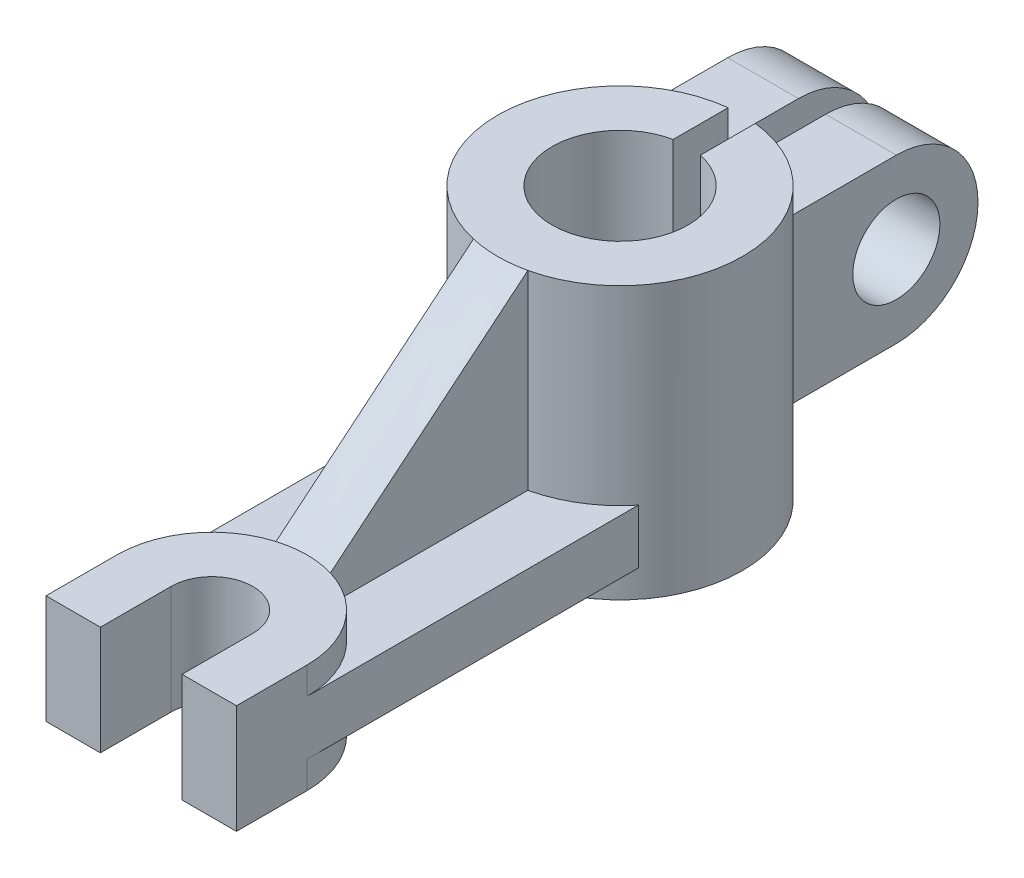
ISO-10303-21;
HEADER;
FILE_DESCRIPTION(('STEP AP214'),'2;1');
FILE_NAME('part.step','',(''),(''),'','','');
FILE_SCHEMA(('AUTOMOTIVE_DESIGN { 1 0 10303 214 1 1 1 1 }'));
ENDSEC;
DATA;
#1=APPLICATION_CONTEXT('core data for automotive mechanical design processes');
#2=APPLICATION_PROTOCOL_DEFINITION('international standard','automotive_design',2000,#1);
#3=PRODUCT_CONTEXT('',#1,'mechanical');
#4=PRODUCT('Part','Part','',(#3));
#5=PRODUCT_RELATED_PRODUCT_CATEGORY('part','',(#4));
#6=PRODUCT_DEFINITION_FORMATION('','',#4);
#7=PRODUCT_DEFINITION_CONTEXT('part definition',#1,'design');
#8=PRODUCT_DEFINITION('design','',#6,#7);
#9=PRODUCT_DEFINITION_SHAPE('','',#8);
#10=(LENGTH_UNIT() NAMED_UNIT(*) SI_UNIT(.MILLI.,.METRE.));
#11=(NAMED_UNIT(*) PLANE_ANGLE_UNIT() SI_UNIT($,.RADIAN.));
#12=(NAMED_UNIT(*) SI_UNIT($,.STERADIAN.) SOLID_ANGLE_UNIT());
#13=UNCERTAINTY_MEASURE_WITH_UNIT(LENGTH_MEASURE(1.E-05),#10,'distance_accuracy_value','');
#14=(GEOMETRIC_REPRESENTATION_CONTEXT(3) GLOBAL_UNCERTAINTY_ASSIGNED_CONTEXT((#13)) GLOBAL_UNIT_ASSIGNED_CONTEXT((#10,
#11,#12)) REPRESENTATION_CONTEXT('',''));
#15=CARTESIAN_POINT('',(0.,0.,0.));
#16=DIRECTION('',(0.,0.,1.));
#17=DIRECTION('',(1.,0.,0.));
#18=AXIS2_PLACEMENT_3D('',#15,#16,#17);
#19=CARTESIAN_POINT('',(0.,45.,-88.));
#20=DIRECTION('',(0.,-1.,0.));
#21=DIRECTION('',(0.,0.,-1.));
#22=AXIS2_PLACEMENT_3D('',#19,#20,#21);
#23=CYLINDRICAL_SURFACE('',#22,22.5);
#24=DIRECTION('',(0.,-1.,0.));
#25=VECTOR('',#24,1.);
#26=CARTESIAN_POINT('',(2.5,45.,-110.360679774998));
#27=LINE('',#26,#25);
#28=CARTESIAN_POINT('',(2.5,45.,-110.360679774998));
#29=VERTEX_POINT('',#28);
#30=CARTESIAN_POINT('',(2.5,40.,-110.360679774998));
#31=VERTEX_POINT('',#30);
#32=EDGE_CURVE('E422',#29,#31,#27,.T.);
#33=ORIENTED_EDGE('',*,*,#32,.F.);
#34=CARTESIAN_POINT('',(0.,45.,-88.));
#35=DIRECTION('',(0.,1.,0.));
#36=DIRECTION('',(0.,0.,1.));
#37=AXIS2_PLACEMENT_3D('',#34,#35,#36);
#38=CIRCLE('',#37,22.5);
#39=CARTESIAN_POINT('',(5.,45.,-66.0625890315197));
#40=VERTEX_POINT('',#39);
#41=EDGE_CURVE('E296',#40,#29,#38,.T.);
#42=ORIENTED_EDGE('',*,*,#41,.F.);
#43=DIRECTION('',(0.,1.,0.));
#44=VECTOR('',#43,1.);
#45=CARTESIAN_POINT('',(5.,45.,-66.0625890315197));
#46=LINE('',#45,#44);
#47=CARTESIAN_POINT('',(5.,10.,-66.0625890315197));
#48=VERTEX_POINT('',#47);
#49=EDGE_CURVE('E321',#48,#40,#46,.T.);
#50=ORIENTED_EDGE('',*,*,#49,.F.);
#51=CARTESIAN_POINT('',(0.,10.,-88.));
#52=DIRECTION('',(0.,1.,0.));
#53=DIRECTION('',(0.,0.,1.));
#54=AXIS2_PLACEMENT_3D('',#51,#52,#53);
#55=CIRCLE('',#54,22.5);
#56=CARTESIAN_POINT('',(17.5,10.,-73.857864376269));
#57=VERTEX_POINT('',#56);
#58=EDGE_CURVE('E289',#48,#57,#55,.T.);
#59=ORIENTED_EDGE('',*,*,#58,.T.);
#60=DIRECTION('',(0.,-1.,0.));
#61=VECTOR('',#60,1.);
#62=CARTESIAN_POINT('',(17.5,10.,-73.857864376269));
#63=LINE('',#62,#61);
#64=CARTESIAN_POINT('',(17.5,0.,-73.857864376269));
#65=VERTEX_POINT('',#64);
#66=EDGE_CURVE('E651',#57,#65,#63,.T.);
#67=ORIENTED_EDGE('',*,*,#66,.T.);
#68=CARTESIAN_POINT('',(0.,0.,-88.));
#69=DIRECTION('',(0.,1.,0.));
#70=DIRECTION('',(0.,0.,1.));
#71=AXIS2_PLACEMENT_3D('',#68,#69,#70);
#72=CIRCLE('',#71,22.5);
#73=CARTESIAN_POINT('',(-17.5,0.,-73.857864376269));
#74=VERTEX_POINT('',#73);
#75=EDGE_CURVE('E300',#74,#65,#72,.T.);
#76=ORIENTED_EDGE('',*,*,#75,.F.);
#77=DIRECTION('',(0.,-1.,0.));
#78=VECTOR('',#77,1.);
#79=CARTESIAN_POINT('',(-17.5,10.,-73.857864376269));
#80=LINE('',#79,#78);
#81=CARTESIAN_POINT('',(-17.5,10.,-73.857864376269));
#82=VERTEX_POINT('',#81);
#83=EDGE_CURVE('E669',#82,#74,#80,.T.);
#84=ORIENTED_EDGE('',*,*,#83,.F.);
#85=CARTESIAN_POINT('',(-5.,10.,-66.0625890315197));
#86=VERTEX_POINT('',#85);
#87=EDGE_CURVE('E292',#82,#86,#55,.T.);
#88=ORIENTED_EDGE('',*,*,#87,.T.);
#89=DIRECTION('',(0.,1.,0.));
#90=VECTOR('',#89,1.);
#91=CARTESIAN_POINT('',(-5.,45.,-66.0625890315197));
#92=LINE('',#91,#90);
#93=CARTESIAN_POINT('',(-5.,45.,-66.0625890315197));
#94=VERTEX_POINT('',#93);
#95=EDGE_CURVE('E342',#86,#94,#92,.T.);
#96=ORIENTED_EDGE('',*,*,#95,.T.);
#97=CARTESIAN_POINT('',(-2.5,45.,-110.360679774998));
#98=VERTEX_POINT('',#97);
#99=EDGE_CURVE('E277',#98,#94,#38,.T.);
#100=ORIENTED_EDGE('',*,*,#99,.F.);
#101=DIRECTION('',(0.,-1.,0.));
#102=VECTOR('',#101,1.);
#103=CARTESIAN_POINT('',(-2.5,45.,-110.360679774998));
#104=LINE('',#103,#102);
#105=CARTESIAN_POINT('',(-2.49999999999999,40.,-110.360679774998));
#106=VERTEX_POINT('',#105);
#107=EDGE_CURVE('E266',#106,#98,#104,.F.);
#108=ORIENTED_EDGE('',*,*,#107,.F.);
#109=CARTESIAN_POINT('',(0.,40.,-88.));
#110=DIRECTION('',(0.,-1.,0.));
#111=DIRECTION('',(0.,0.,-1.));
#112=AXIS2_PLACEMENT_3D('',#109,#110,#111);
#113=CIRCLE('',#112,22.5);
#114=CARTESIAN_POINT('',(-15.5,40.,-104.3095064303));
#115=VERTEX_POINT('',#114);
#116=EDGE_CURVE('E12',#115,#106,#113,.T.);
#117=ORIENTED_EDGE('',*,*,#116,.F.);
#118=DIRECTION('',(0.,-1.,0.));
#119=VECTOR('',#118,1.);
#120=CARTESIAN_POINT('',(-15.5,45.,-104.3095064303));
#121=LINE('',#120,#119);
#122=CARTESIAN_POINT('',(-15.5,10.,-104.3095064303));
#123=VERTEX_POINT('',#122);
#124=EDGE_CURVE('E384',#123,#115,#121,.F.);
#125=ORIENTED_EDGE('',*,*,#124,.F.);
#126=CARTESIAN_POINT('',(0.,10.,-88.));
#127=DIRECTION('',(0.,1.,0.));
#128=DIRECTION('',(0.,0.,1.));
#129=AXIS2_PLACEMENT_3D('',#126,#127,#128);
#130=CIRCLE('',#129,22.5);
#131=CARTESIAN_POINT('',(-2.5,10.,-110.360679774998));
#132=VERTEX_POINT('',#131);
#133=EDGE_CURVE('E261',#132,#123,#130,.T.);
#134=ORIENTED_EDGE('',*,*,#133,.F.);
#135=CARTESIAN_POINT('',(-2.5,-5.,-110.360679774998));
#136=VERTEX_POINT('',#135);
#137=EDGE_CURVE('E76',#136,#132,#104,.F.);
#138=ORIENTED_EDGE('',*,*,#137,.F.);
#139=CARTESIAN_POINT('',(0.,-5.,-88.));
#140=DIRECTION('',(0.,1.,0.));
#141=DIRECTION('',(0.,0.,1.));
#142=AXIS2_PLACEMENT_3D('',#139,#140,#141);
#143=CIRCLE('',#142,22.5);
#144=CARTESIAN_POINT('',(2.5,-5.,-110.360679774998));
#145=VERTEX_POINT('',#144);
#146=EDGE_CURVE('E259',#136,#145,#143,.T.);
#147=ORIENTED_EDGE('',*,*,#146,.T.);
#148=CARTESIAN_POINT('',(2.5,10.,-110.360679774998));
#149=VERTEX_POINT('',#148);
#150=EDGE_CURVE('E418',#149,#145,#27,.T.);
#151=ORIENTED_EDGE('',*,*,#150,.F.);
#152=CARTESIAN_POINT('',(15.5,10.,-104.3095064303));
#153=VERTEX_POINT('',#152);
#154=EDGE_CURVE('E380',#153,#149,#130,.T.);
#155=ORIENTED_EDGE('',*,*,#154,.F.);
#156=DIRECTION('',(0.,-1.,0.));
#157=VECTOR('',#156,1.);
#158=CARTESIAN_POINT('',(15.5,45.,-104.3095064303));
#159=LINE('',#158,#157);
#160=CARTESIAN_POINT('',(15.5,40.,-104.3095064303));
#161=VERTEX_POINT('',#160);
#162=EDGE_CURVE('E388',#153,#161,#159,.F.);
#163=ORIENTED_EDGE('',*,*,#162,.T.);
#164=EDGE_CURVE('E60',#31,#161,#113,.T.);
#165=ORIENTED_EDGE('',*,*,#164,.F.);
#166=EDGE_LOOP('',(#33,#42,#50,#59,#67,#76,#84,#88,#96,#100,#108,#117,#125,#134,#138,#147,#151,
#155,#163,#165));
#167=FACE_BOUND('',#166,.T.);
#168=ADVANCED_FACE('F50',(#167),#23,.T.);
#169=CARTESIAN_POINT('',(0.,45.,-88.));
#170=DIRECTION('',(0.,-1.,0.));
#171=DIRECTION('',(0.,0.,-1.));
#172=AXIS2_PLACEMENT_3D('',#169,#170,#171);
#173=CYLINDRICAL_SURFACE('',#172,12.5);
#174=CARTESIAN_POINT('',(0.,45.,-88.));
#175=DIRECTION('',(0.,1.,0.));
#176=DIRECTION('',(0.,0.,1.));
#177=AXIS2_PLACEMENT_3D('',#174,#175,#176);
#178=CIRCLE('',#177,12.5);
#179=CARTESIAN_POINT('',(-2.49999999999999,45.,-100.247448713916));
#180=VERTEX_POINT('',#179);
#181=CARTESIAN_POINT('',(2.49999999999999,45.,-100.247448713916));
#182=VERTEX_POINT('',#181);
#183=EDGE_CURVE('E270',#180,#182,#178,.T.);
#184=ORIENTED_EDGE('',*,*,#183,.T.);
#185=DIRECTION('',(0.,-1.,0.));
#186=VECTOR('',#185,1.);
#187=CARTESIAN_POINT('',(2.49999999999999,45.,-100.247448713916));
#188=LINE('',#187,#186);
#189=CARTESIAN_POINT('',(2.49999999999999,-5.,-100.247448713916));
#190=VERTEX_POINT('',#189);
#191=EDGE_CURVE('E429',#182,#190,#188,.T.);
#192=ORIENTED_EDGE('',*,*,#191,.T.);
#193=CARTESIAN_POINT('',(0.,-5.,-88.));
#194=DIRECTION('',(0.,1.,0.));
#195=DIRECTION('',(0.,0.,1.));
#196=AXIS2_PLACEMENT_3D('',#193,#194,#195);
#197=CIRCLE('',#196,12.5);
#198=CARTESIAN_POINT('',(-2.49999999999999,-5.,-100.247448713916));
#199=VERTEX_POINT('',#198);
#200=EDGE_CURVE('E271',#199,#190,#197,.T.);
#201=ORIENTED_EDGE('',*,*,#200,.F.);
#202=DIRECTION('',(0.,-1.,0.));
#203=VECTOR('',#202,1.);
#204=CARTESIAN_POINT('',(-2.49999999999999,45.,-100.247448713916));
#205=LINE('',#204,#203);
#206=EDGE_CURVE('E245',#199,#180,#205,.F.);
#207=ORIENTED_EDGE('',*,*,#206,.T.);
#208=EDGE_LOOP('',(#184,#192,#201,#207));
#209=FACE_BOUND('',#208,.T.);
#210=ADVANCED_FACE('F562',(#209),#173,.F.);
#211=CARTESIAN_POINT('',(0.,45.,0.));
#212=DIRECTION('',(0.,1.,0.));
#213=DIRECTION('',(0.,0.,1.));
#214=AXIS2_PLACEMENT_3D('',#211,#212,#213);
#215=PLANE('',#214);
#216=ORIENTED_EDGE('',*,*,#41,.T.);
#217=DIRECTION('',(0.,0.,1.));
#218=VECTOR('',#217,1.);
#219=CARTESIAN_POINT('',(2.49999999999998,45.,0.));
#220=LINE('',#219,#218);
#221=EDGE_CURVE('E425',#29,#182,#220,.T.);
#222=ORIENTED_EDGE('',*,*,#221,.T.);
#223=ORIENTED_EDGE('',*,*,#183,.F.);
#224=DIRECTION('',(0.,0.,-1.));
#225=VECTOR('',#224,1.);
#226=CARTESIAN_POINT('',(-2.49999999999998,45.,0.));
#227=LINE('',#226,#225);
#228=EDGE_CURVE('E407',#180,#98,#227,.T.);
#229=ORIENTED_EDGE('',*,*,#228,.T.);
#230=ORIENTED_EDGE('',*,*,#99,.T.);
#231=CARTESIAN_POINT('',(1.66533453693773E-11,45.,-65.5));
#232=CARTESIAN_POINT('',(-0.127966613440222,44.9999921242405,-65.4999901295293));
#233=CARTESIAN_POINT('',(-0.255934435168659,44.9999663740976,-65.5010661592238));
#234=CARTESIAN_POINT('',(-0.566358750829926,44.9998756278307,-65.5063241894873));
#235=CARTESIAN_POINT('',(-0.748796834333823,44.9997985835739,-65.5116343608658));
#236=CARTESIAN_POINT('',(-1.16821464852716,44.9996083607107,-65.5289886310783));
#237=CARTESIAN_POINT('',(-1.40513130463676,44.9994912769114,-65.5425753892245));
#238=CARTESIAN_POINT('',(-1.93360211912668,44.9991997534531,-65.5812821878649));
#239=CARTESIAN_POINT('',(-2.2250153330263,44.9990183057681,-65.6083527580827));
#240=CARTESIAN_POINT('',(-2.76896867202678,44.9987287580629,-65.6695967794294));
#241=CARTESIAN_POINT('',(-3.02166426223618,44.9986142085641,-65.7023996988718));
#242=CARTESIAN_POINT('',(-3.49648102010595,44.9985426443906,-65.7722672135756));
#243=CARTESIAN_POINT('',(-3.71874058631574,44.9985688599836,-65.8083926943038));
#244=CARTESIAN_POINT('',(-4.13268477732359,44.9987574648783,-65.8820219700267));
#245=CARTESIAN_POINT('',(-4.32451525343845,44.9989013343371,-65.9187076413366));
#246=CARTESIAN_POINT('',(-4.67760204405273,44.9993500184099,-65.99100455899));
#247=CARTESIAN_POINT('',(-4.83900390200514,44.9996265390741,-66.0259064213896));
#248=CARTESIAN_POINT('',(-5.,45.,-66.0625890315197));
#249=B_SPLINE_CURVE_WITH_KNOTS('',3,(#231,#232,#233,#234,#235,#236,#237,#238,#239,#240,#241,
#242,#243,#244,#245,#246,#247,#248),.UNSPECIFIED.,.F.,.F.,(4,2,2,2,2,2,2,2,4),(0.,
0.383898073149994,0.931389474268767,1.64318949280344,2.52096026779738,3.28526328273003,
3.96069074320102,4.54654582615478,5.04190420188116),.UNSPECIFIED.);
#250=CARTESIAN_POINT('',(0.,45.,-65.5));
#251=VERTEX_POINT('',#250);
#252=EDGE_CURVE('E537',#94,#251,#249,.F.);
#253=ORIENTED_EDGE('',*,*,#252,.T.);
#254=CARTESIAN_POINT('',(-5.,45.,-66.0625890315197));
#255=CARTESIAN_POINT('',(-3.33333333333333,45.,-65.6875296771732));
#256=CARTESIAN_POINT('',(0.,45.,-65.3124703228268));
#257=CARTESIAN_POINT('',(3.33333333333333,45.,-65.6875296771732));
#258=CARTESIAN_POINT('',(5.,45.,-66.0625890315197));
#259=B_SPLINE_CURVE_WITH_KNOTS('',3,(#254,#255,#256,#257,#258),.UNSPECIFIED.,.F.,.F.,(4,1,4),
(0.,0.5,1.),.UNSPECIFIED.);
#260=EDGE_CURVE('E332',#40,#251,#259,.F.);
#261=ORIENTED_EDGE('',*,*,#260,.F.);
#262=EDGE_LOOP('',(#216,#222,#223,#229,#230,#253,#261));
#263=FACE_BOUND('',#262,.T.);
#264=ADVANCED_FACE('F543',(#263),#215,.T.);
#265=CARTESIAN_POINT('',(0.,-5.,0.));
#266=DIRECTION('',(0.,1.,0.));
#267=DIRECTION('',(0.,0.,1.));
#268=AXIS2_PLACEMENT_3D('',#265,#266,#267);
#269=PLANE('',#268);
#270=DIRECTION('',(0.,0.,-1.));
#271=VECTOR('',#270,1.);
#272=CARTESIAN_POINT('',(2.49999999999999,-5.,-88.));
#273=LINE('',#272,#271);
#274=EDGE_CURVE('E252',#190,#145,#273,.T.);
#275=ORIENTED_EDGE('',*,*,#274,.T.);
#276=ORIENTED_EDGE('',*,*,#146,.F.);
#277=DIRECTION('',(0.,0.,1.));
#278=VECTOR('',#277,1.);
#279=CARTESIAN_POINT('',(-2.5,-5.,-143.720812674967));
#280=LINE('',#279,#278);
#281=EDGE_CURVE('E242',#136,#199,#280,.T.);
#282=ORIENTED_EDGE('',*,*,#281,.T.);
#283=ORIENTED_EDGE('',*,*,#200,.T.);
#284=EDGE_LOOP('',(#275,#276,#282,#283));
#285=FACE_BOUND('',#284,.T.);
#286=ADVANCED_FACE('F268',(#285),#269,.F.);
#287=CARTESIAN_POINT('',(15.5,25.,-123.28129451576));
#288=DIRECTION('',(-1.,0.,0.));
#289=DIRECTION('',(0.,0.,1.));
#290=AXIS2_PLACEMENT_3D('',#287,#288,#289);
#291=CYLINDRICAL_SURFACE('',#290,15.);
#292=CARTESIAN_POINT('',(2.5,25.,-123.28129451576));
#293=DIRECTION('',(-1.,0.,0.));
#294=DIRECTION('',(0.,0.,1.));
#295=AXIS2_PLACEMENT_3D('',#292,#293,#294);
#296=CIRCLE('',#295,15.);
#297=CARTESIAN_POINT('',(2.5,40.,-123.28129451576));
#298=VERTEX_POINT('',#297);
#299=CARTESIAN_POINT('',(2.5,10.,-123.28129451576));
#300=VERTEX_POINT('',#299);
#301=EDGE_CURVE('E68',#298,#300,#296,.T.);
#302=ORIENTED_EDGE('',*,*,#301,.F.);
#303=DIRECTION('',(-1.,0.,0.));
#304=VECTOR('',#303,1.);
#305=CARTESIAN_POINT('',(15.5,40.,-123.28129451576));
#306=LINE('',#305,#304);
#307=CARTESIAN_POINT('',(15.5,40.,-123.28129451576));
#308=VERTEX_POINT('',#307);
#309=EDGE_CURVE('E372',#308,#298,#306,.T.);
#310=ORIENTED_EDGE('',*,*,#309,.F.);
#311=CARTESIAN_POINT('',(15.5,25.,-123.28129451576));
#312=DIRECTION('',(1.,0.,0.));
#313=DIRECTION('',(0.,0.,-1.));
#314=AXIS2_PLACEMENT_3D('',#311,#312,#313);
#315=CIRCLE('',#314,15.);
#316=CARTESIAN_POINT('',(15.5,10.,-123.28129451576));
#317=VERTEX_POINT('',#316);
#318=EDGE_CURVE('E442',#317,#308,#315,.T.);
#319=ORIENTED_EDGE('',*,*,#318,.F.);
#320=DIRECTION('',(-1.,0.,0.));
#321=VECTOR('',#320,1.);
#322=CARTESIAN_POINT('',(15.5,10.,-123.28129451576));
#323=LINE('',#322,#321);
#324=EDGE_CURVE('E465',#317,#300,#323,.T.);
#325=ORIENTED_EDGE('',*,*,#324,.T.);
#326=EDGE_LOOP('',(#302,#310,#319,#325));
#327=FACE_BOUND('',#326,.T.);
#328=ADVANCED_FACE('F900',(#327),#291,.T.);
#329=CARTESIAN_POINT('',(-2.5,25.,-123.28129451576));
#330=DIRECTION('',(1.,0.,0.));
#331=DIRECTION('',(0.,0.,-1.));
#332=AXIS2_PLACEMENT_3D('',#329,#330,#331);
#333=CIRCLE('',#332,15.);
#334=CARTESIAN_POINT('',(-2.5,10.,-123.28129451576));
#335=VERTEX_POINT('',#334);
#336=CARTESIAN_POINT('',(-2.5,40.,-123.28129451576));
#337=VERTEX_POINT('',#336);
#338=EDGE_CURVE('E264',#335,#337,#333,.T.);
#339=ORIENTED_EDGE('',*,*,#338,.F.);
#340=CARTESIAN_POINT('',(-15.5,10.,-123.28129451576));
#341=VERTEX_POINT('',#340);
#342=EDGE_CURVE('E454',#335,#341,#323,.T.);
#343=ORIENTED_EDGE('',*,*,#342,.T.);
#344=CARTESIAN_POINT('',(-15.5,25.,-123.28129451576));
#345=DIRECTION('',(1.,0.,0.));
#346=DIRECTION('',(0.,0.,-1.));
#347=AXIS2_PLACEMENT_3D('',#344,#345,#346);
#348=CIRCLE('',#347,15.);
#349=CARTESIAN_POINT('',(-15.5,40.,-123.28129451576));
#350=VERTEX_POINT('',#349);
#351=EDGE_CURVE('E438',#341,#350,#348,.T.);
#352=ORIENTED_EDGE('',*,*,#351,.T.);
#353=EDGE_CURVE('E469',#337,#350,#306,.T.);
#354=ORIENTED_EDGE('',*,*,#353,.F.);
#355=EDGE_LOOP('',(#339,#343,#352,#354));
#356=FACE_BOUND('',#355,.T.);
#357=ADVANCED_FACE('F876',(#356),#291,.T.);
#358=CARTESIAN_POINT('',(15.5,40.,-123.28129451576));
#359=DIRECTION('',(0.,-1.,0.));
#360=DIRECTION('',(0.,0.,-1.));
#361=AXIS2_PLACEMENT_3D('',#358,#359,#360);
#362=PLANE('',#361);
#363=DIRECTION('',(0.,0.,-1.));
#364=VECTOR('',#363,1.);
#365=CARTESIAN_POINT('',(2.5,40.,-123.28129451576));
#366=LINE('',#365,#364);
#367=EDGE_CURVE('E421',#31,#298,#366,.T.);
#368=ORIENTED_EDGE('',*,*,#367,.F.);
#369=ORIENTED_EDGE('',*,*,#164,.T.);
#370=DIRECTION('',(0.,0.,1.));
#371=VECTOR('',#370,1.);
#372=CARTESIAN_POINT('',(15.5,40.,-123.28129451576));
#373=LINE('',#372,#371);
#374=EDGE_CURVE('E446',#308,#161,#373,.T.);
#375=ORIENTED_EDGE('',*,*,#374,.F.);
#376=ORIENTED_EDGE('',*,*,#309,.T.);
#377=EDGE_LOOP('',(#368,#369,#375,#376));
#378=FACE_BOUND('',#377,.T.);
#379=ADVANCED_FACE('F891',(#378),#362,.F.);
#380=DIRECTION('',(0.,0.,1.));
#381=VECTOR('',#380,1.);
#382=CARTESIAN_POINT('',(-2.5,40.,-123.28129451576));
#383=LINE('',#382,#381);
#384=EDGE_CURVE('E263',#337,#106,#383,.T.);
#385=ORIENTED_EDGE('',*,*,#384,.F.);
#386=ORIENTED_EDGE('',*,*,#353,.T.);
#387=DIRECTION('',(0.,0.,1.));
#388=VECTOR('',#387,1.);
#389=CARTESIAN_POINT('',(-15.5,40.,-123.28129451576));
#390=LINE('',#389,#388);
#391=EDGE_CURVE('E458',#350,#115,#390,.T.);
#392=ORIENTED_EDGE('',*,*,#391,.T.);
#393=ORIENTED_EDGE('',*,*,#116,.T.);
#394=EDGE_LOOP('',(#385,#386,#392,#393));
#395=FACE_BOUND('',#394,.T.);
#396=ADVANCED_FACE('F868',(#395),#362,.F.);
#397=CARTESIAN_POINT('',(15.5,10.,-101.412692913264));
#398=DIRECTION('',(0.,1.,0.));
#399=DIRECTION('',(0.,0.,1.));
#400=AXIS2_PLACEMENT_3D('',#397,#398,#399);
#401=PLANE('',#400);
#402=DIRECTION('',(0.,0.,1.));
#403=VECTOR('',#402,1.);
#404=CARTESIAN_POINT('',(2.5,10.,-101.412692913264));
#405=LINE('',#404,#403);
#406=EDGE_CURVE('E413',#300,#149,#405,.T.);
#407=ORIENTED_EDGE('',*,*,#406,.F.);
#408=ORIENTED_EDGE('',*,*,#324,.F.);
#409=DIRECTION('',(0.,0.,-1.));
#410=VECTOR('',#409,1.);
#411=CARTESIAN_POINT('',(15.5,10.,-101.412692913264));
#412=LINE('',#411,#410);
#413=EDGE_CURVE('E451',#153,#317,#412,.T.);
#414=ORIENTED_EDGE('',*,*,#413,.F.);
#415=ORIENTED_EDGE('',*,*,#154,.T.);
#416=EDGE_LOOP('',(#407,#408,#414,#415));
#417=FACE_BOUND('',#416,.T.);
#418=ADVANCED_FACE('F902',(#417),#401,.F.);
#419=DIRECTION('',(0.,0.,-1.));
#420=VECTOR('',#419,1.);
#421=CARTESIAN_POINT('',(-2.5,10.,-101.412692913264));
#422=LINE('',#421,#420);
#423=EDGE_CURVE('E393',#132,#335,#422,.T.);
#424=ORIENTED_EDGE('',*,*,#423,.F.);
#425=ORIENTED_EDGE('',*,*,#133,.T.);
#426=DIRECTION('',(0.,0.,-1.));
#427=VECTOR('',#426,1.);
#428=CARTESIAN_POINT('',(-15.5,10.,-101.412692913264));
#429=LINE('',#428,#427);
#430=EDGE_CURVE('E447',#123,#341,#429,.T.);
#431=ORIENTED_EDGE('',*,*,#430,.T.);
#432=ORIENTED_EDGE('',*,*,#342,.F.);
#433=EDGE_LOOP('',(#424,#425,#431,#432));
#434=FACE_BOUND('',#433,.T.);
#435=ADVANCED_FACE('F880',(#434),#401,.F.);
#436=CARTESIAN_POINT('',(15.5,25.,-123.28129451576));
#437=DIRECTION('',(-1.,0.,0.));
#438=DIRECTION('',(0.,0.,1.));
#439=AXIS2_PLACEMENT_3D('',#436,#437,#438);
#440=CYLINDRICAL_SURFACE('',#439,8.);
#441=CARTESIAN_POINT('',(15.5,25.,-123.28129451576));
#442=DIRECTION('',(1.,0.,0.));
#443=DIRECTION('',(0.,0.,-1.));
#444=AXIS2_PLACEMENT_3D('',#441,#442,#443);
#445=CIRCLE('',#444,8.);
#446=CARTESIAN_POINT('',(15.5,25.,-131.28129451576));
#447=VERTEX_POINT('',#446);
#448=EDGE_CURVE('E434',#447,#447,#445,.T.);
#449=ORIENTED_EDGE('',*,*,#448,.T.);
#450=EDGE_LOOP('',(#449));
#451=FACE_BOUND('',#450,.T.);
#452=CARTESIAN_POINT('',(2.5,25.,-123.28129451576));
#453=DIRECTION('',(-1.,0.,0.));
#454=DIRECTION('',(0.,0.,1.));
#455=AXIS2_PLACEMENT_3D('',#452,#453,#454);
#456=CIRCLE('',#455,8.);
#457=CARTESIAN_POINT('',(2.5,25.,-115.28129451576));
#458=VERTEX_POINT('',#457);
#459=EDGE_CURVE('E310',#458,#458,#456,.T.);
#460=ORIENTED_EDGE('',*,*,#459,.T.);
#461=EDGE_LOOP('',(#460));
#462=FACE_BOUND('',#461,.T.);
#463=ADVANCED_FACE('F912',(#451,#462),#440,.F.);
#464=CARTESIAN_POINT('',(-15.5,25.,-123.28129451576));
#465=DIRECTION('',(1.,0.,0.));
#466=DIRECTION('',(0.,0.,-1.));
#467=AXIS2_PLACEMENT_3D('',#464,#465,#466);
#468=CIRCLE('',#467,8.);
#469=CARTESIAN_POINT('',(-15.5,25.,-131.28129451576));
#470=VERTEX_POINT('',#469);
#471=EDGE_CURVE('E433',#470,#470,#468,.T.);
#472=ORIENTED_EDGE('',*,*,#471,.F.);
#473=EDGE_LOOP('',(#472));
#474=FACE_BOUND('',#473,.T.);
#475=CARTESIAN_POINT('',(-2.5,25.,-123.28129451576));
#476=DIRECTION('',(1.,0.,0.));
#477=DIRECTION('',(0.,0.,-1.));
#478=AXIS2_PLACEMENT_3D('',#475,#476,#477);
#479=CIRCLE('',#478,8.);
#480=CARTESIAN_POINT('',(-2.5,25.,-131.28129451576));
#481=VERTEX_POINT('',#480);
#482=EDGE_CURVE('E251',#481,#481,#479,.T.);
#483=ORIENTED_EDGE('',*,*,#482,.T.);
#484=EDGE_LOOP('',(#483));
#485=FACE_BOUND('',#484,.T.);
#486=ADVANCED_FACE('F1032',(#474,#485),#440,.F.);
#487=CARTESIAN_POINT('',(0.,15.,-13.));
#488=DIRECTION('',(0.,-1.,0.));
#489=DIRECTION('',(0.,0.,-1.));
#490=AXIS2_PLACEMENT_3D('',#487,#488,#489);
#491=CYLINDRICAL_SURFACE('',#490,17.5);
#492=CARTESIAN_POINT('',(0.,15.,-13.));
#493=DIRECTION('',(0.,1.,0.));
#494=DIRECTION('',(0.,0.,1.));
#495=AXIS2_PLACEMENT_3D('',#492,#493,#494);
#496=CIRCLE('',#495,17.5);
#497=CARTESIAN_POINT('',(-17.5,15.,-13.));
#498=VERTEX_POINT('',#497);
#499=CARTESIAN_POINT('',(-5.,15.,-29.7705098312484));
#500=VERTEX_POINT('',#499);
#501=EDGE_CURVE('E645',#498,#500,#496,.F.);
#502=ORIENTED_EDGE('',*,*,#501,.T.);
#503=DIRECTION('',(0.,-1.,0.));
#504=VECTOR('',#503,1.);
#505=CARTESIAN_POINT('',(-5.,10.,-29.7705098312484));
#506=LINE('',#505,#504);
#507=CARTESIAN_POINT('',(-5.,10.,-29.7705098312484));
#508=VERTEX_POINT('',#507);
#509=EDGE_CURVE('E351',#500,#508,#506,.T.);
#510=ORIENTED_EDGE('',*,*,#509,.T.);
#511=CARTESIAN_POINT('',(0.,10.,-13.));
#512=DIRECTION('',(0.,1.,0.));
#513=DIRECTION('',(0.,0.,1.));
#514=AXIS2_PLACEMENT_3D('',#511,#512,#513);
#515=CIRCLE('',#514,17.5);
#516=CARTESIAN_POINT('',(-17.5,10.,-13.));
#517=VERTEX_POINT('',#516);
#518=EDGE_CURVE('E638',#517,#508,#515,.F.);
#519=ORIENTED_EDGE('',*,*,#518,.F.);
#520=DIRECTION('',(0.,-1.,0.));
#521=VECTOR('',#520,1.);
#522=CARTESIAN_POINT('',(-17.5,15.,-13.));
#523=LINE('',#522,#521);
#524=EDGE_CURVE('E739',#498,#517,#523,.T.);
#525=ORIENTED_EDGE('',*,*,#524,.F.);
#526=EDGE_LOOP('',(#502,#510,#519,#525));
#527=FACE_BOUND('',#526,.T.);
#528=ADVANCED_FACE('F825',(#527),#491,.T.);
#529=CARTESIAN_POINT('',(5.,10.,-29.7705098312484));
#530=VERTEX_POINT('',#529);
#531=CARTESIAN_POINT('',(17.5,10.,-13.));
#532=VERTEX_POINT('',#531);
#533=EDGE_CURVE('E631',#530,#532,#515,.F.);
#534=ORIENTED_EDGE('',*,*,#533,.F.);
#535=DIRECTION('',(0.,-1.,0.));
#536=VECTOR('',#535,1.);
#537=CARTESIAN_POINT('',(5.,10.,-29.7705098312484));
#538=LINE('',#537,#536);
#539=CARTESIAN_POINT('',(5.,15.,-29.7705098312484));
#540=VERTEX_POINT('',#539);
#541=EDGE_CURVE('E315',#540,#530,#538,.T.);
#542=ORIENTED_EDGE('',*,*,#541,.F.);
#543=CARTESIAN_POINT('',(17.5,15.,-13.));
#544=VERTEX_POINT('',#543);
#545=EDGE_CURVE('E548',#540,#544,#496,.F.);
#546=ORIENTED_EDGE('',*,*,#545,.T.);
#547=DIRECTION('',(0.,-1.,0.));
#548=VECTOR('',#547,1.);
#549=CARTESIAN_POINT('',(17.5,15.,-13.));
#550=LINE('',#549,#548);
#551=EDGE_CURVE('E636',#544,#532,#550,.T.);
#552=ORIENTED_EDGE('',*,*,#551,.T.);
#553=EDGE_LOOP('',(#534,#542,#546,#552));
#554=FACE_BOUND('',#553,.T.);
#555=ADVANCED_FACE('F634',(#554),#491,.T.);
#556=CARTESIAN_POINT('',(0.,10.,0.));
#557=DIRECTION('',(0.,1.,0.));
#558=DIRECTION('',(0.,0.,1.));
#559=AXIS2_PLACEMENT_3D('',#556,#557,#558);
#560=PLANE('',#559);
#561=ORIENTED_EDGE('',*,*,#58,.F.);
#562=DIRECTION('',(0.,0.,-1.));
#563=VECTOR('',#562,1.);
#564=CARTESIAN_POINT('',(5.,10.,-66.0625890315197));
#565=LINE('',#564,#563);
#566=EDGE_CURVE('E608',#530,#48,#565,.T.);
#567=ORIENTED_EDGE('',*,*,#566,.F.);
#568=ORIENTED_EDGE('',*,*,#533,.T.);
#569=DIRECTION('',(0.,0.,-1.));
#570=VECTOR('',#569,1.);
#571=CARTESIAN_POINT('',(17.5,10.,0.));
#572=LINE('',#571,#570);
#573=EDGE_CURVE('E643',#532,#57,#572,.T.);
#574=ORIENTED_EDGE('',*,*,#573,.T.);
#575=EDGE_LOOP('',(#561,#567,#568,#574));
#576=FACE_BOUND('',#575,.T.);
#577=ADVANCED_FACE('F629',(#576),#560,.T.);
#578=CARTESIAN_POINT('',(-17.5,0.,-13.));
#579=VERTEX_POINT('',#578);
#580=CARTESIAN_POINT('',(-17.5,-5.,-13.));
#581=VERTEX_POINT('',#580);
#582=EDGE_CURVE('E738',#579,#581,#523,.T.);
#583=ORIENTED_EDGE('',*,*,#582,.F.);
#584=CARTESIAN_POINT('',(0.,0.,-13.));
#585=DIRECTION('',(0.,1.,0.));
#586=DIRECTION('',(0.,0.,1.));
#587=AXIS2_PLACEMENT_3D('',#584,#585,#586);
#588=CIRCLE('',#587,17.5);
#589=CARTESIAN_POINT('',(17.5,0.,-13.));
#590=VERTEX_POINT('',#589);
#591=EDGE_CURVE('E659',#579,#590,#588,.F.);
#592=ORIENTED_EDGE('',*,*,#591,.T.);
#593=CARTESIAN_POINT('',(17.5,-5.,-13.));
#594=VERTEX_POINT('',#593);
#595=EDGE_CURVE('E743',#590,#594,#550,.T.);
#596=ORIENTED_EDGE('',*,*,#595,.T.);
#597=CARTESIAN_POINT('',(0.,-5.,-13.));
#598=DIRECTION('',(0.,1.,0.));
#599=DIRECTION('',(0.,0.,1.));
#600=AXIS2_PLACEMENT_3D('',#597,#598,#599);
#601=CIRCLE('',#600,17.5);
#602=EDGE_CURVE('E715',#581,#594,#601,.F.);
#603=ORIENTED_EDGE('',*,*,#602,.F.);
#604=EDGE_LOOP('',(#583,#592,#596,#603));
#605=FACE_BOUND('',#604,.T.);
#606=ADVANCED_FACE('F792',(#605),#491,.T.);
#607=CARTESIAN_POINT('',(0.,15.,-13.));
#608=DIRECTION('',(0.,-1.,0.));
#609=DIRECTION('',(0.,0.,-1.));
#610=AXIS2_PLACEMENT_3D('',#607,#608,#609);
#611=CYLINDRICAL_SURFACE('',#610,7.5);
#612=CARTESIAN_POINT('',(0.,-5.,-13.));
#613=DIRECTION('',(0.,1.,0.));
#614=DIRECTION('',(0.,0.,1.));
#615=AXIS2_PLACEMENT_3D('',#612,#613,#614);
#616=CIRCLE('',#615,7.5);
#617=CARTESIAN_POINT('',(-7.5,-5.,-13.0000000000001));
#618=VERTEX_POINT('',#617);
#619=CARTESIAN_POINT('',(7.5,-5.,-13.));
#620=VERTEX_POINT('',#619);
#621=EDGE_CURVE('E673',#618,#620,#616,.F.);
#622=ORIENTED_EDGE('',*,*,#621,.T.);
#623=DIRECTION('',(0.,-1.,0.));
#624=VECTOR('',#623,1.);
#625=CARTESIAN_POINT('',(7.5,15.,-13.));
#626=LINE('',#625,#624);
#627=CARTESIAN_POINT('',(7.5,15.,-13.));
#628=VERTEX_POINT('',#627);
#629=EDGE_CURVE('E301',#628,#620,#626,.T.);
#630=ORIENTED_EDGE('',*,*,#629,.F.);
#631=CARTESIAN_POINT('',(0.,15.,-13.));
#632=DIRECTION('',(0.,1.,0.));
#633=DIRECTION('',(0.,0.,1.));
#634=AXIS2_PLACEMENT_3D('',#631,#632,#633);
#635=CIRCLE('',#634,7.5);
#636=CARTESIAN_POINT('',(-7.5,15.,-13.0000000000001));
#637=VERTEX_POINT('',#636);
#638=EDGE_CURVE('E674',#637,#628,#635,.F.);
#639=ORIENTED_EDGE('',*,*,#638,.F.);
#640=DIRECTION('',(0.,-1.,0.));
#641=VECTOR('',#640,1.);
#642=CARTESIAN_POINT('',(-7.5,15.,-13.0000000000001));
#643=LINE('',#642,#641);
#644=EDGE_CURVE('E701',#637,#618,#643,.T.);
#645=ORIENTED_EDGE('',*,*,#644,.T.);
#646=EDGE_LOOP('',(#622,#630,#639,#645));
#647=FACE_BOUND('',#646,.T.);
#648=ADVANCED_FACE('F52',(#647),#611,.F.);
#649=CARTESIAN_POINT('',(7.5,15.,0.));
#650=DIRECTION('',(1.,0.,0.));
#651=DIRECTION('',(0.,0.,-1.));
#652=AXIS2_PLACEMENT_3D('',#649,#650,#651);
#653=PLANE('',#652);
#654=DIRECTION('',(0.,0.,1.));
#655=VECTOR('',#654,1.);
#656=CARTESIAN_POINT('',(7.5,-5.,0.));
#657=LINE('',#656,#655);
#658=CARTESIAN_POINT('',(7.5,-5.,0.));
#659=VERTEX_POINT('',#658);
#660=EDGE_CURVE('E705',#620,#659,#657,.T.);
#661=ORIENTED_EDGE('',*,*,#660,.T.);
#662=DIRECTION('',(0.,-1.,0.));
#663=VECTOR('',#662,1.);
#664=CARTESIAN_POINT('',(7.5,15.,0.));
#665=LINE('',#664,#663);
#666=CARTESIAN_POINT('',(7.5,15.,0.));
#667=VERTEX_POINT('',#666);
#668=EDGE_CURVE('E749',#667,#659,#665,.T.);
#669=ORIENTED_EDGE('',*,*,#668,.F.);
#670=DIRECTION('',(0.,0.,1.));
#671=VECTOR('',#670,1.);
#672=CARTESIAN_POINT('',(7.5,15.,0.));
#673=LINE('',#672,#671);
#674=EDGE_CURVE('E678',#628,#667,#673,.T.);
#675=ORIENTED_EDGE('',*,*,#674,.F.);
#676=ORIENTED_EDGE('',*,*,#629,.T.);
#677=EDGE_LOOP('',(#661,#669,#675,#676));
#678=FACE_BOUND('',#677,.T.);
#679=ADVANCED_FACE('F762',(#678),#653,.F.);
#680=CARTESIAN_POINT('',(0.,15.,0.));
#681=DIRECTION('',(0.,0.,-1.));
#682=DIRECTION('',(-1.,0.,0.));
#683=AXIS2_PLACEMENT_3D('',#680,#681,#682);
#684=PLANE('',#683);
#685=DIRECTION('',(1.,0.,0.));
#686=VECTOR('',#685,1.);
#687=CARTESIAN_POINT('',(0.,-5.,0.));
#688=LINE('',#687,#686);
#689=CARTESIAN_POINT('',(17.5,-5.,0.));
#690=VERTEX_POINT('',#689);
#691=EDGE_CURVE('E708',#659,#690,#688,.T.);
#692=ORIENTED_EDGE('',*,*,#691,.T.);
#693=DIRECTION('',(0.,-1.,0.));
#694=VECTOR('',#693,1.);
#695=CARTESIAN_POINT('',(17.5,15.,0.));
#696=LINE('',#695,#694);
#697=CARTESIAN_POINT('',(17.5,15.,0.));
#698=VERTEX_POINT('',#697);
#699=EDGE_CURVE('E746',#698,#690,#696,.T.);
#700=ORIENTED_EDGE('',*,*,#699,.F.);
#701=DIRECTION('',(1.,0.,0.));
#702=VECTOR('',#701,1.);
#703=CARTESIAN_POINT('',(0.,15.,0.));
#704=LINE('',#703,#702);
#705=EDGE_CURVE('E682',#667,#698,#704,.T.);
#706=ORIENTED_EDGE('',*,*,#705,.F.);
#707=ORIENTED_EDGE('',*,*,#668,.T.);
#708=EDGE_LOOP('',(#692,#700,#706,#707));
#709=FACE_BOUND('',#708,.T.);
#710=ADVANCED_FACE('F772',(#709),#684,.F.);
#711=CARTESIAN_POINT('',(17.5,15.,0.));
#712=DIRECTION('',(-1.,0.,0.));
#713=DIRECTION('',(0.,0.,1.));
#714=AXIS2_PLACEMENT_3D('',#711,#712,#713);
#715=PLANE('',#714);
#716=DIRECTION('',(0.,0.,-1.));
#717=VECTOR('',#716,1.);
#718=CARTESIAN_POINT('',(17.5,-5.,0.));
#719=LINE('',#718,#717);
#720=EDGE_CURVE('E711',#690,#594,#719,.T.);
#721=ORIENTED_EDGE('',*,*,#720,.T.);
#722=ORIENTED_EDGE('',*,*,#595,.F.);
#723=DIRECTION('',(0.,0.,-1.));
#724=VECTOR('',#723,1.);
#725=CARTESIAN_POINT('',(17.5,0.,0.));
#726=LINE('',#725,#724);
#727=EDGE_CURVE('E663',#590,#65,#726,.T.);
#728=ORIENTED_EDGE('',*,*,#727,.T.);
#729=ORIENTED_EDGE('',*,*,#66,.F.);
#730=ORIENTED_EDGE('',*,*,#573,.F.);
#731=ORIENTED_EDGE('',*,*,#551,.F.);
#732=DIRECTION('',(0.,0.,-1.));
#733=VECTOR('',#732,1.);
#734=CARTESIAN_POINT('',(17.5,15.,0.));
#735=LINE('',#734,#733);
#736=EDGE_CURVE('E685',#698,#544,#735,.T.);
#737=ORIENTED_EDGE('',*,*,#736,.F.);
#738=ORIENTED_EDGE('',*,*,#699,.T.);
#739=EDGE_LOOP('',(#721,#722,#728,#729,#730,#731,#737,#738));
#740=FACE_BOUND('',#739,.T.);
#741=ADVANCED_FACE('F775',(#740),#715,.F.);
#742=CARTESIAN_POINT('',(-17.5,15.,0.));
#743=DIRECTION('',(-1.,0.,0.));
#744=DIRECTION('',(0.,0.,1.));
#745=AXIS2_PLACEMENT_3D('',#742,#743,#744);
#746=PLANE('',#745);
#747=DIRECTION('',(0.,0.,-1.));
#748=VECTOR('',#747,1.);
#749=CARTESIAN_POINT('',(-17.5,-5.,0.));
#750=LINE('',#749,#748);
#751=CARTESIAN_POINT('',(-17.5,-5.,0.));
#752=VERTEX_POINT('',#751);
#753=EDGE_CURVE('E719',#752,#581,#750,.T.);
#754=ORIENTED_EDGE('',*,*,#753,.F.);
#755=DIRECTION('',(0.,-1.,0.));
#756=VECTOR('',#755,1.);
#757=CARTESIAN_POINT('',(-17.5,15.,0.));
#758=LINE('',#757,#756);
#759=CARTESIAN_POINT('',(-17.5,15.,0.));
#760=VERTEX_POINT('',#759);
#761=EDGE_CURVE('E735',#760,#752,#758,.T.);
#762=ORIENTED_EDGE('',*,*,#761,.F.);
#763=DIRECTION('',(0.,0.,-1.));
#764=VECTOR('',#763,1.);
#765=CARTESIAN_POINT('',(-17.5,15.,0.));
#766=LINE('',#765,#764);
#767=EDGE_CURVE('E690',#760,#498,#766,.T.);
#768=ORIENTED_EDGE('',*,*,#767,.T.);
#769=ORIENTED_EDGE('',*,*,#524,.T.);
#770=DIRECTION('',(0.,0.,-1.));
#771=VECTOR('',#770,1.);
#772=CARTESIAN_POINT('',(-17.5,10.,0.));
#773=LINE('',#772,#771);
#774=EDGE_CURVE('E285',#517,#82,#773,.T.);
#775=ORIENTED_EDGE('',*,*,#774,.T.);
#776=ORIENTED_EDGE('',*,*,#83,.T.);
#777=DIRECTION('',(0.,0.,-1.));
#778=VECTOR('',#777,1.);
#779=CARTESIAN_POINT('',(-17.5,0.,0.));
#780=LINE('',#779,#778);
#781=EDGE_CURVE('E655',#579,#74,#780,.T.);
#782=ORIENTED_EDGE('',*,*,#781,.F.);
#783=ORIENTED_EDGE('',*,*,#582,.T.);
#784=EDGE_LOOP('',(#754,#762,#768,#769,#775,#776,#782,#783));
#785=FACE_BOUND('',#784,.T.);
#786=ADVANCED_FACE('F786',(#785),#746,.T.);
#787=CARTESIAN_POINT('',(0.,15.,0.));
#788=DIRECTION('',(0.,0.,-1.));
#789=DIRECTION('',(-1.,0.,0.));
#790=AXIS2_PLACEMENT_3D('',#787,#788,#789);
#791=PLANE('',#790);
#792=DIRECTION('',(1.,0.,0.));
#793=VECTOR('',#792,1.);
#794=CARTESIAN_POINT('',(0.,-5.,0.));
#795=LINE('',#794,#793);
#796=CARTESIAN_POINT('',(-7.5,-5.,0.));
#797=VERTEX_POINT('',#796);
#798=EDGE_CURVE('E723',#752,#797,#795,.T.);
#799=ORIENTED_EDGE('',*,*,#798,.T.);
#800=DIRECTION('',(0.,-1.,0.));
#801=VECTOR('',#800,1.);
#802=CARTESIAN_POINT('',(-7.5,15.,0.));
#803=LINE('',#802,#801);
#804=CARTESIAN_POINT('',(-7.5,15.,0.));
#805=VERTEX_POINT('',#804);
#806=EDGE_CURVE('E731',#805,#797,#803,.T.);
#807=ORIENTED_EDGE('',*,*,#806,.F.);
#808=DIRECTION('',(1.,0.,0.));
#809=VECTOR('',#808,1.);
#810=CARTESIAN_POINT('',(0.,15.,0.));
#811=LINE('',#810,#809);
#812=EDGE_CURVE('E695',#760,#805,#811,.T.);
#813=ORIENTED_EDGE('',*,*,#812,.F.);
#814=ORIENTED_EDGE('',*,*,#761,.T.);
#815=EDGE_LOOP('',(#799,#807,#813,#814));
#816=FACE_BOUND('',#815,.T.);
#817=ADVANCED_FACE('F783',(#816),#791,.F.);
#818=CARTESIAN_POINT('',(-7.5,15.,0.));
#819=DIRECTION('',(-1.,0.,0.));
#820=DIRECTION('',(0.,0.,1.));
#821=AXIS2_PLACEMENT_3D('',#818,#819,#820);
#822=PLANE('',#821);
#823=DIRECTION('',(0.,0.,-1.));
#824=VECTOR('',#823,1.);
#825=CARTESIAN_POINT('',(-7.5,-5.,0.));
#826=LINE('',#825,#824);
#827=EDGE_CURVE('E679',#797,#618,#826,.T.);
#828=ORIENTED_EDGE('',*,*,#827,.T.);
#829=ORIENTED_EDGE('',*,*,#644,.F.);
#830=DIRECTION('',(0.,0.,-1.));
#831=VECTOR('',#830,1.);
#832=CARTESIAN_POINT('',(-7.5,15.,0.));
#833=LINE('',#832,#831);
#834=EDGE_CURVE('E698',#805,#637,#833,.T.);
#835=ORIENTED_EDGE('',*,*,#834,.F.);
#836=ORIENTED_EDGE('',*,*,#806,.T.);
#837=EDGE_LOOP('',(#828,#829,#835,#836));
#838=FACE_BOUND('',#837,.T.);
#839=ADVANCED_FACE('F594',(#838),#822,.F.);
#840=CARTESIAN_POINT('',(0.,15.,0.));
#841=DIRECTION('',(0.,1.,0.));
#842=DIRECTION('',(0.,0.,1.));
#843=AXIS2_PLACEMENT_3D('',#840,#841,#842);
#844=PLANE('',#843);
#845=CARTESIAN_POINT('',(-5.,15.,-29.7705098312484));
#846=CARTESIAN_POINT('',(-3.33333333333333,15.,-30.2568366104161));
#847=CARTESIAN_POINT('',(0.,15.,-30.7431633895839));
#848=CARTESIAN_POINT('',(3.33333333333333,15.,-30.2568366104161));
#849=CARTESIAN_POINT('',(5.,15.,-29.7705098312484));
#850=B_SPLINE_CURVE_WITH_KNOTS('',3,(#845,#846,#847,#848,#849),.UNSPECIFIED.,.F.,.F.,(4,1,4),
(0.,0.5,1.),.UNSPECIFIED.);
#851=CARTESIAN_POINT('',(-1.45862199633455E-12,15.,-30.5));
#852=VERTEX_POINT('',#851);
#853=EDGE_CURVE('E318',#500,#852,#850,.T.);
#854=ORIENTED_EDGE('',*,*,#853,.F.);
#855=ORIENTED_EDGE('',*,*,#501,.F.);
#856=ORIENTED_EDGE('',*,*,#767,.F.);
#857=ORIENTED_EDGE('',*,*,#812,.T.);
#858=ORIENTED_EDGE('',*,*,#834,.T.);
#859=ORIENTED_EDGE('',*,*,#638,.T.);
#860=ORIENTED_EDGE('',*,*,#674,.T.);
#861=ORIENTED_EDGE('',*,*,#705,.T.);
#862=ORIENTED_EDGE('',*,*,#736,.T.);
#863=ORIENTED_EDGE('',*,*,#545,.F.);
#864=CARTESIAN_POINT('',(-5.,15.,-29.7705098312484));
#865=CARTESIAN_POINT('',(-3.33333333333333,15.,-30.2568366104161));
#866=CARTESIAN_POINT('',(0.,15.,-30.7431633895839));
#867=CARTESIAN_POINT('',(3.33333333333333,15.,-30.2568366104161));
#868=CARTESIAN_POINT('',(5.,15.,-29.7705098312484));
#869=B_SPLINE_CURVE_WITH_KNOTS('',3,(#864,#865,#866,#867,#868),.UNSPECIFIED.,.F.,.F.,(4,1,4),
(0.,0.5,1.),.UNSPECIFIED.);
#870=EDGE_CURVE('E322',#852,#540,#869,.T.);
#871=ORIENTED_EDGE('',*,*,#870,.F.);
#872=EDGE_LOOP('',(#854,#855,#856,#857,#858,#859,#860,#861,#862,#863,#871));
#873=FACE_BOUND('',#872,.T.);
#874=ADVANCED_FACE('F583',(#873),#844,.T.);
#875=CARTESIAN_POINT('',(0.,-5.,0.));
#876=DIRECTION('',(0.,1.,0.));
#877=DIRECTION('',(0.,0.,1.));
#878=AXIS2_PLACEMENT_3D('',#875,#876,#877);
#879=PLANE('',#878);
#880=ORIENTED_EDGE('',*,*,#621,.F.);
#881=ORIENTED_EDGE('',*,*,#827,.F.);
#882=ORIENTED_EDGE('',*,*,#798,.F.);
#883=ORIENTED_EDGE('',*,*,#753,.T.);
#884=ORIENTED_EDGE('',*,*,#602,.T.);
#885=ORIENTED_EDGE('',*,*,#720,.F.);
#886=ORIENTED_EDGE('',*,*,#691,.F.);
#887=ORIENTED_EDGE('',*,*,#660,.F.);
#888=EDGE_LOOP('',(#880,#881,#882,#883,#884,#885,#886,#887));
#889=FACE_BOUND('',#888,.T.);
#890=ADVANCED_FACE('F593',(#889),#879,.F.);
#891=DIRECTION('',(0.,0.,-1.));
#892=VECTOR('',#891,1.);
#893=CARTESIAN_POINT('',(-5.,10.,-66.0625890315197));
#894=LINE('',#893,#892);
#895=EDGE_CURVE('E363',#508,#86,#894,.T.);
#896=ORIENTED_EDGE('',*,*,#895,.T.);
#897=ORIENTED_EDGE('',*,*,#87,.F.);
#898=ORIENTED_EDGE('',*,*,#774,.F.);
#899=ORIENTED_EDGE('',*,*,#518,.T.);
#900=EDGE_LOOP('',(#896,#897,#898,#899));
#901=FACE_BOUND('',#900,.T.);
#902=ADVANCED_FACE('F828',(#901),#560,.T.);
#903=CARTESIAN_POINT('',(0.,0.,0.));
#904=DIRECTION('',(0.,1.,0.));
#905=DIRECTION('',(0.,0.,1.));
#906=AXIS2_PLACEMENT_3D('',#903,#904,#905);
#907=PLANE('',#906);
#908=ORIENTED_EDGE('',*,*,#75,.T.);
#909=ORIENTED_EDGE('',*,*,#727,.F.);
#910=ORIENTED_EDGE('',*,*,#591,.F.);
#911=ORIENTED_EDGE('',*,*,#781,.T.);
#912=EDGE_LOOP('',(#908,#909,#910,#911));
#913=FACE_BOUND('',#912,.T.);
#914=ADVANCED_FACE('F491',(#913),#907,.F.);
#915=CARTESIAN_POINT('',(-5.,45.,-66.0625890315197));
#916=CARTESIAN_POINT('',(-3.33333333333333,45.,-65.6875296771732));
#917=CARTESIAN_POINT('',(0.,45.,-65.3124703228268));
#918=CARTESIAN_POINT('',(3.33333333333333,45.,-65.6875296771732));
#919=CARTESIAN_POINT('',(5.,45.,-66.0625890315197));
#920=CARTESIAN_POINT('',(-5.,35.,-53.9652292980959));
#921=CARTESIAN_POINT('',(-3.33333333333333,35.,-53.8772986549208));
#922=CARTESIAN_POINT('',(0.,35.,-53.7893680117458));
#923=CARTESIAN_POINT('',(3.33333333333333,35.,-53.8772986549208));
#924=CARTESIAN_POINT('',(5.,35.,-53.9652292980959));
#925=CARTESIAN_POINT('',(-5.,25.,-41.8678695646722));
#926=CARTESIAN_POINT('',(-3.33333333333333,25.,-42.0670676326685));
#927=CARTESIAN_POINT('',(0.,25.,-42.2662657006648));
#928=CARTESIAN_POINT('',(3.33333333333333,25.,-42.0670676326685));
#929=CARTESIAN_POINT('',(5.,25.,-41.8678695646722));
#930=CARTESIAN_POINT('',(-5.,15.,-29.7705098312484));
#931=CARTESIAN_POINT('',(-3.33333333333333,15.,-30.2568366104161));
#932=CARTESIAN_POINT('',(0.,15.,-30.7431633895839));
#933=CARTESIAN_POINT('',(3.33333333333333,15.,-30.2568366104161));
#934=CARTESIAN_POINT('',(5.,15.,-29.7705098312484));
#935=B_SPLINE_SURFACE_WITH_KNOTS('',3,3,((#915,#916,#917,#918,#919),(#920,#921,#922,#923,#924),
(#925,#926,#927,#928,#929),(#930,#931,#932,#933,#934)),.UNSPECIFIED.,.F.,.F.,.F.,(4,4),(4,1,4),
(0.,1.),(0.,0.5,1.),.UNSPECIFIED.);
#936=DIRECTION('',(0.,-0.637128662867516,0.770757463118361));
#937=VECTOR('',#936,1.);
#938=CARTESIAN_POINT('',(-5.,45.,-66.0625890315197));
#939=LINE('',#938,#937);
#940=EDGE_CURVE('E346',#94,#500,#939,.T.);
#941=DIRECTION('',(0.,-0.637128662867516,0.770757463118361));
#942=VECTOR('',#941,1.);
#943=CARTESIAN_POINT('',(5.,45.,-66.0625890315197));
#944=LINE('',#943,#942);
#945=EDGE_CURVE('E279',#40,#540,#944,.T.);
#946=ORIENTED_EDGE('',*,*,#252,.F.);
#947=ORIENTED_EDGE('',*,*,#940,.T.);
#948=ORIENTED_EDGE('',*,*,#853,.T.);
#949=ORIENTED_EDGE('',*,*,#870,.T.);
#950=ORIENTED_EDGE('',*,*,#945,.F.);
#951=ORIENTED_EDGE('',*,*,#260,.T.);
#952=EDGE_LOOP('',(#946,#947,#948,#949,#950,#951));
#953=FACE_BOUND('',#952,.T.);
#954=ADVANCED_FACE('F478',(#953),#935,.T.);
#955=CARTESIAN_POINT('',(5.,0.,0.));
#956=DIRECTION('',(-1.,0.,0.));
#957=DIRECTION('',(0.,0.,1.));
#958=AXIS2_PLACEMENT_3D('',#955,#956,#957);
#959=PLANE('',#958);
#960=ORIENTED_EDGE('',*,*,#49,.T.);
#961=ORIENTED_EDGE('',*,*,#945,.T.);
#962=ORIENTED_EDGE('',*,*,#541,.T.);
#963=ORIENTED_EDGE('',*,*,#566,.T.);
#964=EDGE_LOOP('',(#960,#961,#962,#963));
#965=FACE_BOUND('',#964,.T.);
#966=ADVANCED_FACE('F490',(#965),#959,.F.);
#967=CARTESIAN_POINT('',(-5.,0.,0.));
#968=DIRECTION('',(-1.,0.,0.));
#969=DIRECTION('',(0.,0.,1.));
#970=AXIS2_PLACEMENT_3D('',#967,#968,#969);
#971=PLANE('',#970);
#972=ORIENTED_EDGE('',*,*,#895,.F.);
#973=ORIENTED_EDGE('',*,*,#509,.F.);
#974=ORIENTED_EDGE('',*,*,#940,.F.);
#975=ORIENTED_EDGE('',*,*,#95,.F.);
#976=EDGE_LOOP('',(#972,#973,#974,#975));
#977=FACE_BOUND('',#976,.T.);
#978=ADVANCED_FACE('F492',(#977),#971,.T.);
#979=CARTESIAN_POINT('',(15.5,25.,-123.28129451576));
#980=DIRECTION('',(1.,0.,0.));
#981=DIRECTION('',(0.,0.,-1.));
#982=AXIS2_PLACEMENT_3D('',#979,#980,#981);
#983=PLANE('',#982);
#984=ORIENTED_EDGE('',*,*,#448,.F.);
#985=EDGE_LOOP('',(#984));
#986=FACE_BOUND('',#985,.T.);
#987=ORIENTED_EDGE('',*,*,#162,.F.);
#988=ORIENTED_EDGE('',*,*,#413,.T.);
#989=ORIENTED_EDGE('',*,*,#318,.T.);
#990=ORIENTED_EDGE('',*,*,#374,.T.);
#991=EDGE_LOOP('',(#987,#988,#989,#990));
#992=FACE_BOUND('',#991,.T.);
#993=ADVANCED_FACE('F895',(#986,#992),#983,.T.);
#994=CARTESIAN_POINT('',(-15.5,25.,-123.28129451576));
#995=DIRECTION('',(1.,0.,0.));
#996=DIRECTION('',(0.,0.,-1.));
#997=AXIS2_PLACEMENT_3D('',#994,#995,#996);
#998=PLANE('',#997);
#999=ORIENTED_EDGE('',*,*,#471,.T.);
#1000=EDGE_LOOP('',(#999));
#1001=FACE_BOUND('',#1000,.T.);
#1002=ORIENTED_EDGE('',*,*,#430,.F.);
#1003=ORIENTED_EDGE('',*,*,#124,.T.);
#1004=ORIENTED_EDGE('',*,*,#391,.F.);
#1005=ORIENTED_EDGE('',*,*,#351,.F.);
#1006=EDGE_LOOP('',(#1002,#1003,#1004,#1005));
#1007=FACE_BOUND('',#1006,.T.);
#1008=ADVANCED_FACE('F874',(#1001,#1007),#998,.F.);
#1009=CARTESIAN_POINT('',(-2.5,45.0172261638314,-143.720812674967));
#1010=DIRECTION('',(1.,0.,0.));
#1011=DIRECTION('',(0.,0.,-1.));
#1012=AXIS2_PLACEMENT_3D('',#1009,#1010,#1011);
#1013=PLANE('',#1012);
#1014=ORIENTED_EDGE('',*,*,#482,.F.);
#1015=EDGE_LOOP('',(#1014));
#1016=FACE_BOUND('',#1015,.T.);
#1017=ORIENTED_EDGE('',*,*,#281,.F.);
#1018=ORIENTED_EDGE('',*,*,#137,.T.);
#1019=ORIENTED_EDGE('',*,*,#423,.T.);
#1020=ORIENTED_EDGE('',*,*,#338,.T.);
#1021=ORIENTED_EDGE('',*,*,#384,.T.);
#1022=ORIENTED_EDGE('',*,*,#107,.T.);
#1023=ORIENTED_EDGE('',*,*,#228,.F.);
#1024=ORIENTED_EDGE('',*,*,#206,.F.);
#1025=EDGE_LOOP('',(#1017,#1018,#1019,#1020,#1021,#1022,#1023,#1024));
#1026=FACE_BOUND('',#1025,.T.);
#1027=ADVANCED_FACE('F243',(#1016,#1026),#1013,.T.);
#1028=CARTESIAN_POINT('',(2.49999999999999,45.0172261638314,-88.));
#1029=DIRECTION('',(-1.,0.,0.));
#1030=DIRECTION('',(0.,0.,1.));
#1031=AXIS2_PLACEMENT_3D('',#1028,#1029,#1030);
#1032=PLANE('',#1031);
#1033=ORIENTED_EDGE('',*,*,#221,.F.);
#1034=ORIENTED_EDGE('',*,*,#32,.T.);
#1035=ORIENTED_EDGE('',*,*,#367,.T.);
#1036=ORIENTED_EDGE('',*,*,#301,.T.);
#1037=ORIENTED_EDGE('',*,*,#406,.T.);
#1038=ORIENTED_EDGE('',*,*,#150,.T.);
#1039=ORIENTED_EDGE('',*,*,#274,.F.);
#1040=ORIENTED_EDGE('',*,*,#191,.F.);
#1041=EDGE_LOOP('',(#1033,#1034,#1035,#1036,#1037,#1038,#1039,#1040));
#1042=FACE_BOUND('',#1041,.T.);
#1043=ORIENTED_EDGE('',*,*,#459,.F.);
#1044=EDGE_LOOP('',(#1043));
#1045=FACE_BOUND('',#1044,.T.);
#1046=ADVANCED_FACE('F844',(#1042,#1045),#1032,.T.);
#1047=CLOSED_SHELL('',(#168,#210,#264,#286,#328,#357,#379,#396,#418,#435,#463,#486,#528,#555,
#577,#606,#648,#679,#710,#741,#786,#817,#839,#874,#890,#902,#914,#954,#966,#978,#993,#1008,
#1027,#1046));
#1048=MANIFOLD_SOLID_BREP('B2',#1047);
#1049=ADVANCED_BREP_SHAPE_REPRESENTATION('',(#18,#1048),#14);
#1050=SHAPE_DEFINITION_REPRESENTATION(#9,#1049);
ENDSEC;
END-ISO-10303-21;
